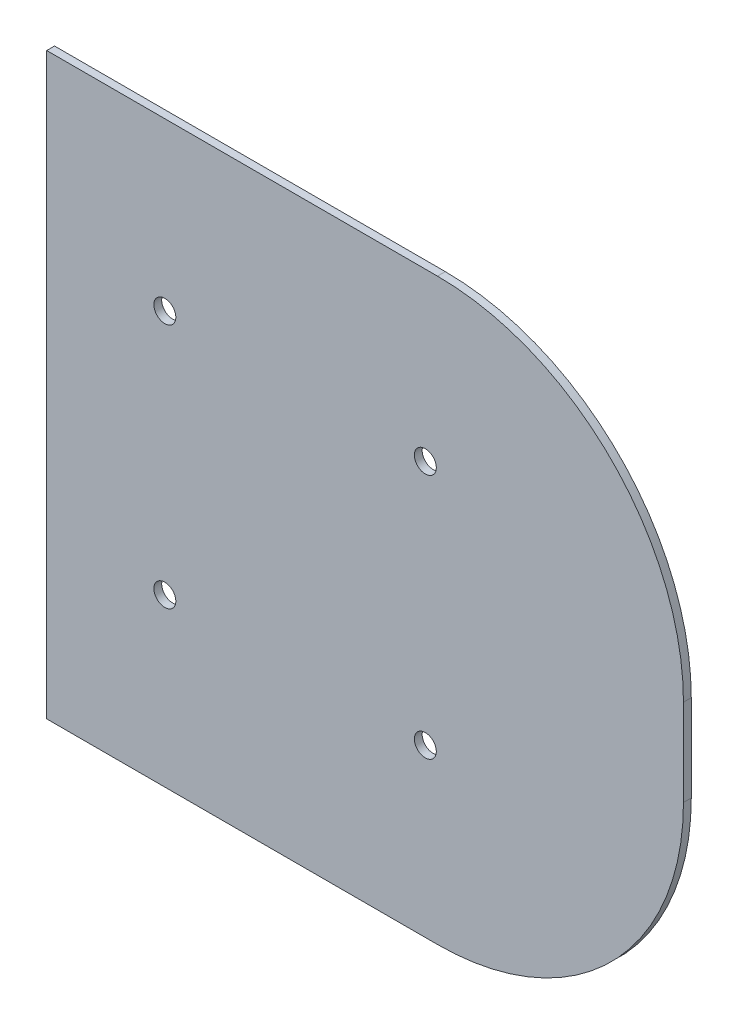
ISO-10303-21;
HEADER;
FILE_DESCRIPTION(('STEP AP214'),'2;1');
FILE_NAME('part.step','',(''),(''),'','','');
FILE_SCHEMA(('AUTOMOTIVE_DESIGN { 1 0 10303 214 1 1 1 1 }'));
ENDSEC;
DATA;
#1=APPLICATION_CONTEXT('core data for automotive mechanical design processes');
#2=APPLICATION_PROTOCOL_DEFINITION('international standard','automotive_design',2000,#1);
#3=PRODUCT_CONTEXT('',#1,'mechanical');
#4=PRODUCT('Part','Part','',(#3));
#5=PRODUCT_RELATED_PRODUCT_CATEGORY('part','',(#4));
#6=PRODUCT_DEFINITION_FORMATION('','',#4);
#7=PRODUCT_DEFINITION_CONTEXT('part definition',#1,'design');
#8=PRODUCT_DEFINITION('design','',#6,#7);
#9=PRODUCT_DEFINITION_SHAPE('','',#8);
#10=(LENGTH_UNIT() NAMED_UNIT(*) SI_UNIT(.MILLI.,.METRE.));
#11=(NAMED_UNIT(*) PLANE_ANGLE_UNIT() SI_UNIT($,.RADIAN.));
#12=(NAMED_UNIT(*) SI_UNIT($,.STERADIAN.) SOLID_ANGLE_UNIT());
#13=UNCERTAINTY_MEASURE_WITH_UNIT(LENGTH_MEASURE(1.E-05),#10,'distance_accuracy_value','');
#14=(GEOMETRIC_REPRESENTATION_CONTEXT(3) GLOBAL_UNCERTAINTY_ASSIGNED_CONTEXT((#13)) GLOBAL_UNIT_ASSIGNED_CONTEXT((#10,
#11,#12)) REPRESENTATION_CONTEXT('',''));
#15=CARTESIAN_POINT('',(0.,0.,0.));
#16=DIRECTION('',(0.,0.,1.));
#17=DIRECTION('',(1.,0.,0.));
#18=AXIS2_PLACEMENT_3D('',#15,#16,#17);
#19=CARTESIAN_POINT('',(-110.,-100.,2.7));
#20=DIRECTION('',(1.,0.,0.));
#21=DIRECTION('',(0.,0.,-1.));
#22=AXIS2_PLACEMENT_3D('',#19,#20,#21);
#23=PLANE('',#22);
#24=DIRECTION('',(0.,-1.,0.));
#25=VECTOR('',#24,1.);
#26=CARTESIAN_POINT('',(-110.,-100.,0.));
#27=LINE('',#26,#25);
#28=CARTESIAN_POINT('',(-110.,100.,0.));
#29=VERTEX_POINT('',#28);
#30=CARTESIAN_POINT('',(-110.,-100.,0.));
#31=VERTEX_POINT('',#30);
#32=EDGE_CURVE('E119',#29,#31,#27,.T.);
#33=ORIENTED_EDGE('',*,*,#32,.T.);
#34=DIRECTION('',(0.,0.,-1.));
#35=VECTOR('',#34,1.);
#36=CARTESIAN_POINT('',(-110.,-100.,2.7));
#37=LINE('',#36,#35);
#38=CARTESIAN_POINT('',(-110.,-100.,2.7));
#39=VERTEX_POINT('',#38);
#40=EDGE_CURVE('E11',#39,#31,#37,.T.);
#41=ORIENTED_EDGE('',*,*,#40,.F.);
#42=DIRECTION('',(0.,-1.,0.));
#43=VECTOR('',#42,1.);
#44=CARTESIAN_POINT('',(-110.,-100.,2.7));
#45=LINE('',#44,#43);
#46=CARTESIAN_POINT('',(-110.,100.,2.7));
#47=VERTEX_POINT('',#46);
#48=EDGE_CURVE('E130',#47,#39,#45,.T.);
#49=ORIENTED_EDGE('',*,*,#48,.F.);
#50=DIRECTION('',(0.,0.,-1.));
#51=VECTOR('',#50,1.);
#52=CARTESIAN_POINT('',(-110.,100.,2.7));
#53=LINE('',#52,#51);
#54=EDGE_CURVE('E115',#47,#29,#53,.T.);
#55=ORIENTED_EDGE('',*,*,#54,.T.);
#56=EDGE_LOOP('',(#33,#41,#49,#55));
#57=FACE_BOUND('',#56,.T.);
#58=ADVANCED_FACE('F33',(#57),#23,.F.);
#59=CARTESIAN_POINT('',(-110.,-100.,2.7));
#60=DIRECTION('',(0.,1.,0.));
#61=DIRECTION('',(0.,0.,1.));
#62=AXIS2_PLACEMENT_3D('',#59,#60,#61);
#63=PLANE('',#62);
#64=DIRECTION('',(1.,0.,0.));
#65=VECTOR('',#64,1.);
#66=CARTESIAN_POINT('',(-110.,-100.,0.));
#67=LINE('',#66,#65);
#68=CARTESIAN_POINT('',(25.,-100.,0.));
#69=VERTEX_POINT('',#68);
#70=EDGE_CURVE('E122',#31,#69,#67,.T.);
#71=ORIENTED_EDGE('',*,*,#70,.T.);
#72=DIRECTION('',(0.,0.,-1.));
#73=VECTOR('',#72,1.);
#74=CARTESIAN_POINT('',(25.,-100.,2.7));
#75=LINE('',#74,#73);
#76=CARTESIAN_POINT('',(25.,-100.,2.7));
#77=VERTEX_POINT('',#76);
#78=EDGE_CURVE('E42',#77,#69,#75,.T.);
#79=ORIENTED_EDGE('',*,*,#78,.F.);
#80=DIRECTION('',(1.,0.,0.));
#81=VECTOR('',#80,1.);
#82=CARTESIAN_POINT('',(-110.,-100.,2.7));
#83=LINE('',#82,#81);
#84=EDGE_CURVE('E88',#39,#77,#83,.T.);
#85=ORIENTED_EDGE('',*,*,#84,.F.);
#86=ORIENTED_EDGE('',*,*,#40,.T.);
#87=EDGE_LOOP('',(#71,#79,#85,#86));
#88=FACE_BOUND('',#87,.T.);
#89=ADVANCED_FACE('F162',(#88),#63,.F.);
#90=CARTESIAN_POINT('',(25.,-15.,2.7));
#91=DIRECTION('',(0.,0.,-1.));
#92=DIRECTION('',(-1.,0.,0.));
#93=AXIS2_PLACEMENT_3D('',#90,#91,#92);
#94=CYLINDRICAL_SURFACE('',#93,85.);
#95=CARTESIAN_POINT('',(25.,-15.,0.));
#96=DIRECTION('',(0.,0.,1.));
#97=DIRECTION('',(1.,0.,0.));
#98=AXIS2_PLACEMENT_3D('',#95,#96,#97);
#99=CIRCLE('',#98,85.);
#100=CARTESIAN_POINT('',(110.,-15.,0.));
#101=VERTEX_POINT('',#100);
#102=EDGE_CURVE('E125',#69,#101,#99,.T.);
#103=ORIENTED_EDGE('',*,*,#102,.T.);
#104=DIRECTION('',(0.,0.,-1.));
#105=VECTOR('',#104,1.);
#106=CARTESIAN_POINT('',(110.,-15.,2.7));
#107=LINE('',#106,#105);
#108=CARTESIAN_POINT('',(110.,-15.,2.7));
#109=VERTEX_POINT('',#108);
#110=EDGE_CURVE('E110',#109,#101,#107,.T.);
#111=ORIENTED_EDGE('',*,*,#110,.F.);
#112=CARTESIAN_POINT('',(25.,-15.,2.7));
#113=DIRECTION('',(0.,0.,1.));
#114=DIRECTION('',(1.,0.,0.));
#115=AXIS2_PLACEMENT_3D('',#112,#113,#114);
#116=CIRCLE('',#115,85.);
#117=EDGE_CURVE('E101',#77,#109,#116,.T.);
#118=ORIENTED_EDGE('',*,*,#117,.F.);
#119=ORIENTED_EDGE('',*,*,#78,.T.);
#120=EDGE_LOOP('',(#103,#111,#118,#119));
#121=FACE_BOUND('',#120,.T.);
#122=ADVANCED_FACE('F165',(#121),#94,.T.);
#123=CARTESIAN_POINT('',(110.,-15.,2.7));
#124=DIRECTION('',(-1.,0.,0.));
#125=DIRECTION('',(0.,-1.,0.));
#126=AXIS2_PLACEMENT_3D('',#123,#124,#125);
#127=PLANE('',#126);
#128=DIRECTION('',(0.,1.,0.));
#129=VECTOR('',#128,1.);
#130=CARTESIAN_POINT('',(110.,-15.,0.));
#131=LINE('',#130,#129);
#132=CARTESIAN_POINT('',(110.,15.,0.));
#133=VERTEX_POINT('',#132);
#134=EDGE_CURVE('E109',#101,#133,#131,.T.);
#135=ORIENTED_EDGE('',*,*,#134,.T.);
#136=DIRECTION('',(0.,0.,-1.));
#137=VECTOR('',#136,1.);
#138=CARTESIAN_POINT('',(110.,15.,2.7));
#139=LINE('',#138,#137);
#140=CARTESIAN_POINT('',(110.,15.,2.7));
#141=VERTEX_POINT('',#140);
#142=EDGE_CURVE('E106',#141,#133,#139,.T.);
#143=ORIENTED_EDGE('',*,*,#142,.F.);
#144=DIRECTION('',(0.,1.,0.));
#145=VECTOR('',#144,1.);
#146=CARTESIAN_POINT('',(110.,-15.,2.7));
#147=LINE('',#146,#145);
#148=EDGE_CURVE('E95',#109,#141,#147,.T.);
#149=ORIENTED_EDGE('',*,*,#148,.F.);
#150=ORIENTED_EDGE('',*,*,#110,.T.);
#151=EDGE_LOOP('',(#135,#143,#149,#150));
#152=FACE_BOUND('',#151,.T.);
#153=ADVANCED_FACE('F107',(#152),#127,.F.);
#154=CARTESIAN_POINT('',(25.,15.,2.7));
#155=DIRECTION('',(0.,0.,-1.));
#156=DIRECTION('',(-1.,0.,0.));
#157=AXIS2_PLACEMENT_3D('',#154,#155,#156);
#158=CYLINDRICAL_SURFACE('',#157,85.);
#159=CARTESIAN_POINT('',(25.,15.,0.));
#160=DIRECTION('',(0.,0.,1.));
#161=DIRECTION('',(-1.,0.,0.));
#162=AXIS2_PLACEMENT_3D('',#159,#160,#161);
#163=CIRCLE('',#162,85.);
#164=CARTESIAN_POINT('',(25.,100.,0.));
#165=VERTEX_POINT('',#164);
#166=EDGE_CURVE('E74',#133,#165,#163,.T.);
#167=ORIENTED_EDGE('',*,*,#166,.T.);
#168=DIRECTION('',(0.,0.,-1.));
#169=VECTOR('',#168,1.);
#170=CARTESIAN_POINT('',(25.,100.,2.7));
#171=LINE('',#170,#169);
#172=CARTESIAN_POINT('',(25.,100.,2.7));
#173=VERTEX_POINT('',#172);
#174=EDGE_CURVE('E111',#173,#165,#171,.T.);
#175=ORIENTED_EDGE('',*,*,#174,.F.);
#176=CARTESIAN_POINT('',(25.,15.,2.7));
#177=DIRECTION('',(0.,0.,1.));
#178=DIRECTION('',(-1.,0.,0.));
#179=AXIS2_PLACEMENT_3D('',#176,#177,#178);
#180=CIRCLE('',#179,85.);
#181=EDGE_CURVE('E99',#141,#173,#180,.T.);
#182=ORIENTED_EDGE('',*,*,#181,.F.);
#183=ORIENTED_EDGE('',*,*,#142,.T.);
#184=EDGE_LOOP('',(#167,#175,#182,#183));
#185=FACE_BOUND('',#184,.T.);
#186=ADVANCED_FACE('F113',(#185),#158,.T.);
#187=CARTESIAN_POINT('',(-110.,100.,2.7));
#188=DIRECTION('',(0.,-1.,0.));
#189=DIRECTION('',(0.,0.,-1.));
#190=AXIS2_PLACEMENT_3D('',#187,#188,#189);
#191=PLANE('',#190);
#192=DIRECTION('',(-1.,0.,0.));
#193=VECTOR('',#192,1.);
#194=CARTESIAN_POINT('',(-110.,100.,0.));
#195=LINE('',#194,#193);
#196=EDGE_CURVE('E80',#165,#29,#195,.T.);
#197=ORIENTED_EDGE('',*,*,#196,.T.);
#198=ORIENTED_EDGE('',*,*,#54,.F.);
#199=DIRECTION('',(-1.,0.,0.));
#200=VECTOR('',#199,1.);
#201=CARTESIAN_POINT('',(-110.,100.,2.7));
#202=LINE('',#201,#200);
#203=EDGE_CURVE('E51',#173,#47,#202,.T.);
#204=ORIENTED_EDGE('',*,*,#203,.F.);
#205=ORIENTED_EDGE('',*,*,#174,.T.);
#206=EDGE_LOOP('',(#197,#198,#204,#205));
#207=FACE_BOUND('',#206,.T.);
#208=ADVANCED_FACE('F170',(#207),#191,.F.);
#209=CARTESIAN_POINT('',(25.,15.,2.7));
#210=DIRECTION('',(0.,0.,-1.));
#211=DIRECTION('',(-1.,0.,0.));
#212=AXIS2_PLACEMENT_3D('',#209,#210,#211);
#213=PLANE('',#212);
#214=CARTESIAN_POINT('',(-69.1871914812023,-42.4685606246405,2.7));
#215=DIRECTION('',(0.,0.,1.));
#216=DIRECTION('',(-1.,0.,0.));
#217=AXIS2_PLACEMENT_3D('',#214,#215,#216);
#218=CIRCLE('',#217,3.79000000000001);
#219=CARTESIAN_POINT('',(-72.9771914812023,-42.4685606246405,2.7));
#220=VERTEX_POINT('',#219);
#221=EDGE_CURVE('E154',#220,#220,#218,.T.);
#222=ORIENTED_EDGE('',*,*,#221,.F.);
#223=EDGE_LOOP('',(#222));
#224=FACE_BOUND('',#223,.T.);
#225=CARTESIAN_POINT('',(20.8128085187977,-42.4685606246405,2.7));
#226=DIRECTION('',(0.,0.,1.));
#227=DIRECTION('',(-1.,0.,0.));
#228=AXIS2_PLACEMENT_3D('',#225,#226,#227);
#229=CIRCLE('',#228,3.79);
#230=CARTESIAN_POINT('',(17.0228085187977,-42.4685606246405,2.7));
#231=VERTEX_POINT('',#230);
#232=EDGE_CURVE('E144',#231,#231,#229,.T.);
#233=ORIENTED_EDGE('',*,*,#232,.F.);
#234=EDGE_LOOP('',(#233));
#235=FACE_BOUND('',#234,.T.);
#236=CARTESIAN_POINT('',(20.8128085187977,42.4685606246405,2.7));
#237=DIRECTION('',(0.,0.,1.));
#238=DIRECTION('',(1.,0.,0.));
#239=AXIS2_PLACEMENT_3D('',#236,#237,#238);
#240=CIRCLE('',#239,3.79);
#241=CARTESIAN_POINT('',(24.6028085187977,42.4685606246405,2.7));
#242=VERTEX_POINT('',#241);
#243=EDGE_CURVE('E141',#242,#242,#240,.T.);
#244=ORIENTED_EDGE('',*,*,#243,.F.);
#245=EDGE_LOOP('',(#244));
#246=FACE_BOUND('',#245,.T.);
#247=CARTESIAN_POINT('',(-69.1871914812023,42.4685606246405,2.7));
#248=DIRECTION('',(0.,0.,1.));
#249=DIRECTION('',(1.,0.,0.));
#250=AXIS2_PLACEMENT_3D('',#247,#248,#249);
#251=CIRCLE('',#250,3.79000000000001);
#252=CARTESIAN_POINT('',(-65.3971914812023,42.4685606246405,2.7));
#253=VERTEX_POINT('',#252);
#254=EDGE_CURVE('E138',#253,#253,#251,.T.);
#255=ORIENTED_EDGE('',*,*,#254,.F.);
#256=EDGE_LOOP('',(#255));
#257=FACE_BOUND('',#256,.T.);
#258=ORIENTED_EDGE('',*,*,#48,.T.);
#259=ORIENTED_EDGE('',*,*,#84,.T.);
#260=ORIENTED_EDGE('',*,*,#117,.T.);
#261=ORIENTED_EDGE('',*,*,#148,.T.);
#262=ORIENTED_EDGE('',*,*,#181,.T.);
#263=ORIENTED_EDGE('',*,*,#203,.T.);
#264=EDGE_LOOP('',(#258,#259,#260,#261,#262,#263));
#265=FACE_BOUND('',#264,.T.);
#266=ADVANCED_FACE('F97',(#224,#235,#246,#257,#265),#213,.F.);
#267=CARTESIAN_POINT('',(25.,15.,0.));
#268=DIRECTION('',(0.,0.,-1.));
#269=DIRECTION('',(-1.,0.,0.));
#270=AXIS2_PLACEMENT_3D('',#267,#268,#269);
#271=PLANE('',#270);
#272=CARTESIAN_POINT('',(-69.1871914812023,-42.4685606246405,0.));
#273=DIRECTION('',(0.,0.,-1.));
#274=DIRECTION('',(-1.,0.,0.));
#275=AXIS2_PLACEMENT_3D('',#272,#273,#274);
#276=CIRCLE('',#275,3.79000000000001);
#277=CARTESIAN_POINT('',(-72.9771914812023,-42.4685606246405,0.));
#278=VERTEX_POINT('',#277);
#279=EDGE_CURVE('E36',#278,#278,#276,.T.);
#280=ORIENTED_EDGE('',*,*,#279,.F.);
#281=EDGE_LOOP('',(#280));
#282=FACE_BOUND('',#281,.T.);
#283=CARTESIAN_POINT('',(20.8128085187977,-42.4685606246405,0.));
#284=DIRECTION('',(0.,0.,-1.));
#285=DIRECTION('',(-1.,0.,0.));
#286=AXIS2_PLACEMENT_3D('',#283,#284,#285);
#287=CIRCLE('',#286,3.79);
#288=CARTESIAN_POINT('',(17.0228085187977,-42.4685606246405,0.));
#289=VERTEX_POINT('',#288);
#290=EDGE_CURVE('E142',#289,#289,#287,.T.);
#291=ORIENTED_EDGE('',*,*,#290,.F.);
#292=EDGE_LOOP('',(#291));
#293=FACE_BOUND('',#292,.T.);
#294=CARTESIAN_POINT('',(20.8128085187977,42.4685606246405,0.));
#295=DIRECTION('',(0.,0.,-1.));
#296=DIRECTION('',(-1.,0.,0.));
#297=AXIS2_PLACEMENT_3D('',#294,#295,#296);
#298=CIRCLE('',#297,3.79);
#299=CARTESIAN_POINT('',(17.0228085187977,42.4685606246405,0.));
#300=VERTEX_POINT('',#299);
#301=EDGE_CURVE('E139',#300,#300,#298,.T.);
#302=ORIENTED_EDGE('',*,*,#301,.F.);
#303=EDGE_LOOP('',(#302));
#304=FACE_BOUND('',#303,.T.);
#305=CARTESIAN_POINT('',(-69.1871914812023,42.4685606246405,0.));
#306=DIRECTION('',(0.,0.,-1.));
#307=DIRECTION('',(-1.,0.,0.));
#308=AXIS2_PLACEMENT_3D('',#305,#306,#307);
#309=CIRCLE('',#308,3.79000000000001);
#310=CARTESIAN_POINT('',(-72.9771914812023,42.4685606246405,0.));
#311=VERTEX_POINT('',#310);
#312=EDGE_CURVE('E123',#311,#311,#309,.T.);
#313=ORIENTED_EDGE('',*,*,#312,.F.);
#314=EDGE_LOOP('',(#313));
#315=FACE_BOUND('',#314,.T.);
#316=ORIENTED_EDGE('',*,*,#32,.F.);
#317=ORIENTED_EDGE('',*,*,#196,.F.);
#318=ORIENTED_EDGE('',*,*,#166,.F.);
#319=ORIENTED_EDGE('',*,*,#134,.F.);
#320=ORIENTED_EDGE('',*,*,#102,.F.);
#321=ORIENTED_EDGE('',*,*,#70,.F.);
#322=EDGE_LOOP('',(#316,#317,#318,#319,#320,#321));
#323=FACE_BOUND('',#322,.T.);
#324=ADVANCED_FACE('F168',(#282,#293,#304,#315,#323),#271,.T.);
#325=CARTESIAN_POINT('',(-69.1871914812023,42.4685606246405,-0.0499999999999997));
#326=DIRECTION('',(0.,0.,1.));
#327=DIRECTION('',(1.,0.,0.));
#328=AXIS2_PLACEMENT_3D('',#325,#326,#327);
#329=CYLINDRICAL_SURFACE('',#328,3.79000000000001);
#330=ORIENTED_EDGE('',*,*,#312,.T.);
#331=EDGE_LOOP('',(#330));
#332=FACE_BOUND('',#331,.T.);
#333=ORIENTED_EDGE('',*,*,#254,.T.);
#334=EDGE_LOOP('',(#333));
#335=FACE_BOUND('',#334,.T.);
#336=ADVANCED_FACE('F218',(#332,#335),#329,.F.);
#337=CARTESIAN_POINT('',(20.8128085187977,42.4685606246405,-0.0499999999999997));
#338=DIRECTION('',(0.,0.,1.));
#339=DIRECTION('',(1.,0.,0.));
#340=AXIS2_PLACEMENT_3D('',#337,#338,#339);
#341=CYLINDRICAL_SURFACE('',#340,3.79);
#342=ORIENTED_EDGE('',*,*,#301,.T.);
#343=EDGE_LOOP('',(#342));
#344=FACE_BOUND('',#343,.T.);
#345=ORIENTED_EDGE('',*,*,#243,.T.);
#346=EDGE_LOOP('',(#345));
#347=FACE_BOUND('',#346,.T.);
#348=ADVANCED_FACE('F227',(#344,#347),#341,.F.);
#349=CARTESIAN_POINT('',(20.8128085187977,-42.4685606246405,-0.0499999999999997));
#350=DIRECTION('',(0.,0.,1.));
#351=DIRECTION('',(1.,0.,0.));
#352=AXIS2_PLACEMENT_3D('',#349,#350,#351);
#353=CYLINDRICAL_SURFACE('',#352,3.79);
#354=ORIENTED_EDGE('',*,*,#290,.T.);
#355=EDGE_LOOP('',(#354));
#356=FACE_BOUND('',#355,.T.);
#357=ORIENTED_EDGE('',*,*,#232,.T.);
#358=EDGE_LOOP('',(#357));
#359=FACE_BOUND('',#358,.T.);
#360=ADVANCED_FACE('F237',(#356,#359),#353,.F.);
#361=CARTESIAN_POINT('',(-69.1871914812023,-42.4685606246405,-0.0499999999999997));
#362=DIRECTION('',(0.,0.,1.));
#363=DIRECTION('',(1.,0.,0.));
#364=AXIS2_PLACEMENT_3D('',#361,#362,#363);
#365=CYLINDRICAL_SURFACE('',#364,3.79000000000001);
#366=ORIENTED_EDGE('',*,*,#279,.T.);
#367=EDGE_LOOP('',(#366));
#368=FACE_BOUND('',#367,.T.);
#369=ORIENTED_EDGE('',*,*,#221,.T.);
#370=EDGE_LOOP('',(#369));
#371=FACE_BOUND('',#370,.T.);
#372=ADVANCED_FACE('F247',(#368,#371),#365,.F.);
#373=CLOSED_SHELL('',(#58,#89,#122,#153,#186,#208,#266,#324,#336,#348,#360,#372));
#374=MANIFOLD_SOLID_BREP('B2',#373);
#375=ADVANCED_BREP_SHAPE_REPRESENTATION('',(#18,#374),#14);
#376=SHAPE_DEFINITION_REPRESENTATION(#9,#375);
ENDSEC;
END-ISO-10303-21;
